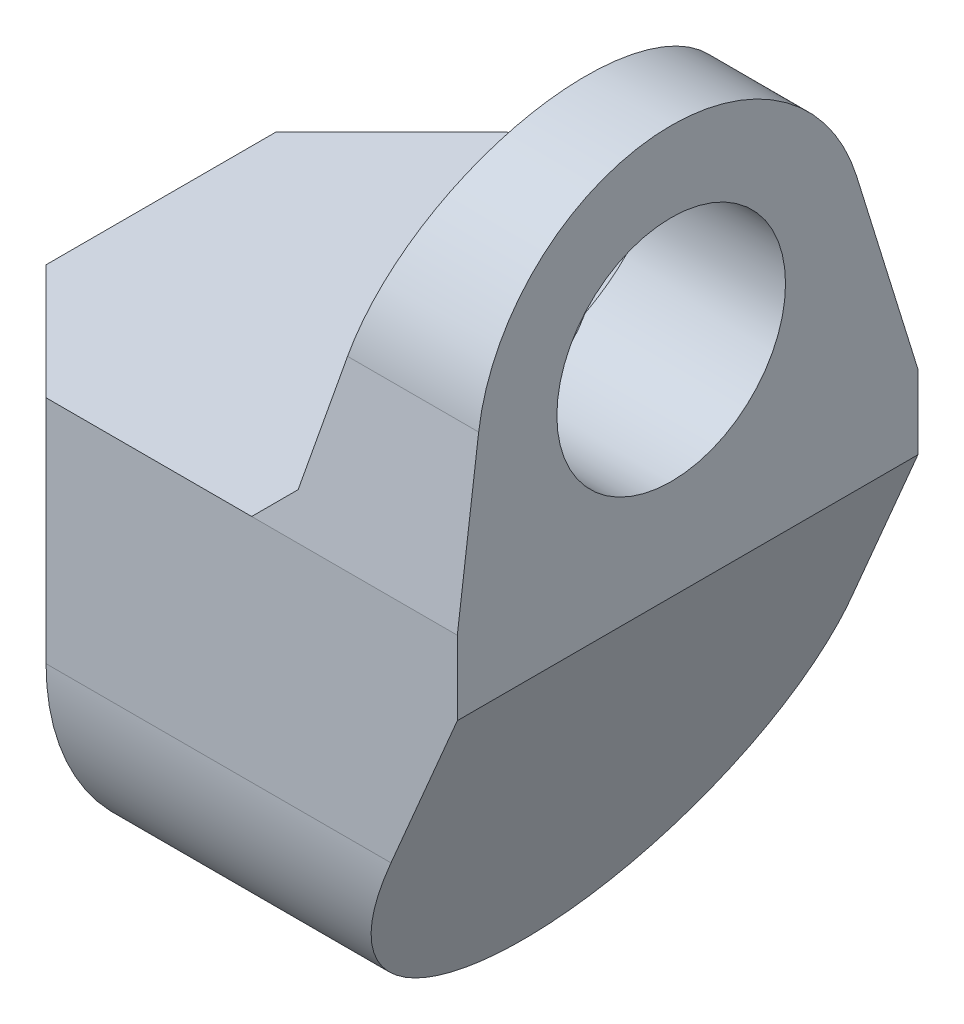
ISO-10303-21;
HEADER;
FILE_DESCRIPTION(('STEP AP214'),'2;1');
FILE_NAME('part.step','',(''),(''),'','','');
FILE_SCHEMA(('AUTOMOTIVE_DESIGN { 1 0 10303 214 1 1 1 1 }'));
ENDSEC;
DATA;
#1=APPLICATION_CONTEXT('core data for automotive mechanical design processes');
#2=APPLICATION_PROTOCOL_DEFINITION('international standard','automotive_design',2000,#1);
#3=PRODUCT_CONTEXT('',#1,'mechanical');
#4=PRODUCT('Part','Part','',(#3));
#5=PRODUCT_RELATED_PRODUCT_CATEGORY('part','',(#4));
#6=PRODUCT_DEFINITION_FORMATION('','',#4);
#7=PRODUCT_DEFINITION_CONTEXT('part definition',#1,'design');
#8=PRODUCT_DEFINITION('design','',#6,#7);
#9=PRODUCT_DEFINITION_SHAPE('','',#8);
#10=(LENGTH_UNIT() NAMED_UNIT(*) SI_UNIT(.MILLI.,.METRE.));
#11=(NAMED_UNIT(*) PLANE_ANGLE_UNIT() SI_UNIT($,.RADIAN.));
#12=(NAMED_UNIT(*) SI_UNIT($,.STERADIAN.) SOLID_ANGLE_UNIT());
#13=UNCERTAINTY_MEASURE_WITH_UNIT(LENGTH_MEASURE(1.E-05),#10,'distance_accuracy_value','');
#14=(GEOMETRIC_REPRESENTATION_CONTEXT(3) GLOBAL_UNCERTAINTY_ASSIGNED_CONTEXT((#13)) GLOBAL_UNIT_ASSIGNED_CONTEXT((#10,
#11,#12)) REPRESENTATION_CONTEXT('',''));
#15=CARTESIAN_POINT('',(0.,0.,0.));
#16=DIRECTION('',(0.,0.,1.));
#17=DIRECTION('',(1.,0.,0.));
#18=AXIS2_PLACEMENT_3D('',#15,#16,#17);
#19=CARTESIAN_POINT('',(319.371159880093,1786.74217662689,-331.667531895439));
#20=DIRECTION('',(-0.965640375771162,0.259882020695022,0.));
#21=DIRECTION('',(-0.259882020695022,-0.965640375771162,0.));
#22=AXIS2_PLACEMENT_3D('',#19,#20,#21);
#23=PLANE('',#22);
#24=DIRECTION('',(0.,0.,1.));
#25=VECTOR('',#24,1.);
#26=CARTESIAN_POINT('',(60.,823.,-331.667531895439));
#27=LINE('',#26,#25);
#28=CARTESIAN_POINT('',(60.0000000000007,823.,-132.249851931471));
#29=VERTEX_POINT('',#28);
#30=CARTESIAN_POINT('',(60.0000000000007,823.,-41.3763217311523));
#31=VERTEX_POINT('',#30);
#32=EDGE_CURVE('E215',#29,#31,#27,.T.);
#33=ORIENTED_EDGE('',*,*,#32,.T.);
#34=CARTESIAN_POINT('',(-43.,440.28418750003,-1.62382802516847E-13));
#35=DIRECTION('',(-0.965640375771162,0.259882020695022,0.));
#36=DIRECTION('',(-0.259882020695022,-0.965640375771162,0.));
#37=AXIS2_PLACEMENT_3D('',#34,#35,#36);
#38=ELLIPSE('',#37,427.116888283168,111.);
#39=CARTESIAN_POINT('',(62.1309255663078,830.917853490161,-35.6158460459868));
#40=VERTEX_POINT('',#39);
#41=EDGE_CURVE('E136',#31,#40,#38,.F.);
#42=ORIENTED_EDGE('',*,*,#41,.T.);
#43=CARTESIAN_POINT('',(76.2427545373522,883.353,10.0000000000007));
#44=DIRECTION('',(-0.965640375771162,0.259882020695022,0.));
#45=DIRECTION('',(-0.259882020695022,-0.965640375771162,0.));
#46=AXIS2_PLACEMENT_3D('',#43,#44,#45);
#47=ELLIPSE('',#46,71.972963997593,69.5);
#48=CARTESIAN_POINT('',(60.0000000000008,823.,44.4639723624544));
#49=VERTEX_POINT('',#48);
#50=EDGE_CURVE('E209',#40,#49,#47,.F.);
#51=ORIENTED_EDGE('',*,*,#50,.T.);
#52=CARTESIAN_POINT('',(60.0000000000009,823.,136.772089545314));
#53=VERTEX_POINT('',#52);
#54=EDGE_CURVE('E214',#49,#53,#27,.T.);
#55=ORIENTED_EDGE('',*,*,#54,.T.);
#56=DIRECTION('',(-0.257885322763063,-0.958221270224104,0.12372209824237));
#57=VECTOR('',#56,1.);
#58=CARTESIAN_POINT('',(77.2960859992147,887.266850546203,128.4741839946));
#59=LINE('',#58,#57);
#60=CARTESIAN_POINT('',(80.3093789853908,898.463305628774,127.028537817942));
#61=VERTEX_POINT('',#60);
#62=EDGE_CURVE('E27',#61,#53,#59,.T.);
#63=ORIENTED_EDGE('',*,*,#62,.F.);
#64=CARTESIAN_POINT('',(76.2427545373526,883.353,10.0000000000009));
#65=DIRECTION('',(-0.965640375771162,0.259882020695022,0.));
#66=DIRECTION('',(0.259882020695022,0.965640375771162,0.));
#67=AXIS2_PLACEMENT_3D('',#64,#65,#66);
#68=ELLIPSE('',#67,122.198701463538,118.);
#69=CARTESIAN_POINT('',(85.6461997966869,918.293264007046,-102.708375691952));
#70=VERTEX_POINT('',#69);
#71=EDGE_CURVE('E219',#70,#61,#68,.F.);
#72=ORIENTED_EDGE('',*,*,#71,.F.);
#73=DIRECTION('',(0.248966036329765,0.925079989114983,0.286780275634968));
#74=VECTOR('',#73,1.);
#75=CARTESIAN_POINT('',(52.1392110414814,793.791764726698,-141.304577859013));
#76=LINE('',#75,#74);
#77=EDGE_CURVE('E222',#29,#70,#76,.T.);
#78=ORIENTED_EDGE('',*,*,#77,.F.);
#79=EDGE_LOOP('',(#33,#42,#51,#55,#63,#72,#78));
#80=FACE_BOUND('',#79,.T.);
#81=ADVANCED_FACE('F17',(#80),#23,.T.);
#82=CARTESIAN_POINT('',(60.,823.,-331.667531895439));
#83=DIRECTION('',(-0.707106781186534,0.707106781186561,0.));
#84=DIRECTION('',(-0.707106781186561,-0.707106781186534,0.));
#85=AXIS2_PLACEMENT_3D('',#82,#83,#84);
#86=PLANE('',#85);
#87=DIRECTION('',(0.,0.,-1.));
#88=VECTOR('',#87,1.);
#89=CARTESIAN_POINT('',(35.,798.,140.));
#90=LINE('',#89,#88);
#91=CARTESIAN_POINT('',(35.,798.,-78.9746794865287));
#92=VERTEX_POINT('',#91);
#93=CARTESIAN_POINT('',(35.000000000002,798.,-140.));
#94=VERTEX_POINT('',#93);
#95=EDGE_CURVE('E21',#92,#94,#90,.T.);
#96=ORIENTED_EDGE('',*,*,#95,.F.);
#97=CARTESIAN_POINT('',(-43.,720.,-1.62382802516847E-13));
#98=DIRECTION('',(-0.707106781186534,0.707106781186561,0.));
#99=DIRECTION('',(-0.707106781186561,-0.707106781186534,0.));
#100=AXIS2_PLACEMENT_3D('',#97,#98,#99);
#101=ELLIPSE('',#100,156.97770542341,111.);
#102=EDGE_CURVE('E126',#92,#31,#101,.F.);
#103=ORIENTED_EDGE('',*,*,#102,.T.);
#104=ORIENTED_EDGE('',*,*,#32,.F.);
#105=DIRECTION('',(0.690706623375974,0.690706623375947,0.214123144123091));
#106=VECTOR('',#105,1.);
#107=CARTESIAN_POINT('',(34.9999999999993,798.,-140.));
#108=LINE('',#107,#106);
#109=EDGE_CURVE('E223',#94,#29,#108,.T.);
#110=ORIENTED_EDGE('',*,*,#109,.F.);
#111=EDGE_LOOP('',(#96,#103,#104,#110));
#112=FACE_BOUND('',#111,.T.);
#113=ADVANCED_FACE('F281',(#112),#86,.T.);
#114=CARTESIAN_POINT('',(120.353000000003,883.353,10.0000000000007));
#115=DIRECTION('',(-0.707106781186534,0.707106781186561,0.));
#116=DIRECTION('',(-0.707106781186561,-0.707106781186534,0.));
#117=AXIS2_PLACEMENT_3D('',#114,#115,#116);
#118=ELLIPSE('',#117,98.287842584932,69.5);
#119=CARTESIAN_POINT('',(59.2690958361265,822.26909583613,43.1512692381247));
#120=VERTEX_POINT('',#119);
#121=EDGE_CURVE('E11',#49,#120,#118,.F.);
#122=ORIENTED_EDGE('',*,*,#121,.T.);
#123=CARTESIAN_POINT('',(35.,798.,78.9746794865285));
#124=VERTEX_POINT('',#123);
#125=EDGE_CURVE('E123',#120,#124,#101,.F.);
#126=ORIENTED_EDGE('',*,*,#125,.T.);
#127=CARTESIAN_POINT('',(35.0000000000036,798.,140.));
#128=VERTEX_POINT('',#127);
#129=EDGE_CURVE('E133',#128,#124,#90,.T.);
#130=ORIENTED_EDGE('',*,*,#129,.F.);
#131=DIRECTION('',(-0.704178025032377,-0.70417802503235,0.0909209443584944));
#132=VECTOR('',#131,1.);
#133=CARTESIAN_POINT('',(85.6468987058924,848.646898705895,133.460653846792));
#134=LINE('',#133,#132);
#135=EDGE_CURVE('E218',#53,#128,#134,.T.);
#136=ORIENTED_EDGE('',*,*,#135,.F.);
#137=ORIENTED_EDGE('',*,*,#54,.F.);
#138=EDGE_LOOP('',(#122,#126,#130,#136,#137));
#139=FACE_BOUND('',#138,.T.);
#140=ADVANCED_FACE('F131',(#139),#86,.T.);
#141=CARTESIAN_POINT('',(407.98183232407,883.353,10.0000000000009));
#142=DIRECTION('',(-1.,0.,0.));
#143=DIRECTION('',(0.,0.,-1.));
#144=AXIS2_PLACEMENT_3D('',#141,#142,#143);
#145=CYLINDRICAL_SURFACE('',#144,69.5);
#146=CARTESIAN_POINT('',(160.000000000003,883.353,10.0000000000007));
#147=DIRECTION('',(1.,0.,0.));
#148=DIRECTION('',(0.,0.,-1.));
#149=AXIS2_PLACEMENT_3D('',#146,#147,#148);
#150=CIRCLE('',#149,69.5);
#151=CARTESIAN_POINT('',(160.000000000004,883.353,-59.4999999999993));
#152=VERTEX_POINT('',#151);
#153=EDGE_CURVE('E211',#152,#152,#150,.F.);
#154=ORIENTED_EDGE('',*,*,#153,.F.);
#155=EDGE_LOOP('',(#154));
#156=FACE_BOUND('',#155,.T.);
#157=ORIENTED_EDGE('',*,*,#50,.F.);
#158=CARTESIAN_POINT('',(65.9736376474425,945.5,-21.1127046558196));
#159=CARTESIAN_POINT('',(65.8006410151382,945.052943275867,-22.0057150498637));
#160=CARTESIAN_POINT('',(65.6183792952828,944.58736345789,-22.8875955845663));
#161=CARTESIAN_POINT('',(65.237097127852,943.620431751345,-24.6276898034623));
#162=CARTESIAN_POINT('',(65.0380784577303,943.119083657672,-25.4859059850082));
#163=CARTESIAN_POINT('',(64.625155384937,942.082143196159,-27.1768851356325));
#164=CARTESIAN_POINT('',(64.4112610867585,941.546574093157,-28.0096648400049));
#165=CARTESIAN_POINT('',(63.9703068368445,940.442132951406,-29.6491882064526));
#166=CARTESIAN_POINT('',(63.7432465332711,939.873260022667,-30.455931171845));
#167=CARTESIAN_POINT('',(63.0458105470094,938.120253409246,-32.833041335095));
#168=CARTESIAN_POINT('',(62.5584331639003,936.887881449309,-34.3633011931569));
#169=CARTESIAN_POINT('',(61.5537214462687,934.303694536806,-37.3087469547833));
#170=CARTESIAN_POINT('',(61.0363816923088,932.951857952702,-38.7239119285924));
#171=CARTESIAN_POINT('',(59.9886662929027,930.139924376088,-41.429874750167));
#172=CARTESIAN_POINT('',(59.4583228051839,928.680079360265,-42.7209468557326));
#173=CARTESIAN_POINT('',(58.3996418415073,925.656845031051,-45.1763241492804));
#174=CARTESIAN_POINT('',(57.8713042724953,924.093460584463,-46.3406352887876));
#175=CARTESIAN_POINT('',(56.8328008101944,920.868606532021,-48.5375086898656));
#176=CARTESIAN_POINT('',(56.3226532208256,919.207042362254,-49.5699408012391));
#177=CARTESIAN_POINT('',(55.3382740192143,915.794180629648,-51.4951760424935));
#178=CARTESIAN_POINT('',(54.8640434567459,914.042880446534,-52.3879750920252));
#179=CARTESIAN_POINT('',(54.1866659897433,911.330327262562,-53.6281852875815));
#180=CARTESIAN_POINT('',(53.9637208159321,910.398458817249,-54.0298863150441));
#181=CARTESIAN_POINT('',(53.5343950686727,908.514768990434,-54.793269075291));
#182=CARTESIAN_POINT('',(53.3280125358563,907.562949985943,-55.1549555437382));
#183=CARTESIAN_POINT('',(52.9341016175231,905.640690347141,-55.8372940113944));
#184=CARTESIAN_POINT('',(52.7465764605586,904.670246557853,-56.1579389864861));
#185=CARTESIAN_POINT('',(52.3926788914098,902.712738220274,-56.7570071610336));
#186=CARTESIAN_POINT('',(52.2263035893257,901.725675963634,-57.0354361298564));
#187=CARTESIAN_POINT('',(51.9170357818495,899.738437717045,-57.5486399579915));
#188=CARTESIAN_POINT('',(51.7741040893184,898.738286691514,-57.7834877535433));
#189=CARTESIAN_POINT('',(51.5132881650056,896.72554506547,-58.2091117240324));
#190=CARTESIAN_POINT('',(51.3954005168281,895.712956181635,-58.399893910512));
#191=CARTESIAN_POINT('',(51.1862840631226,893.677701717087,-58.736557465581));
#192=CARTESIAN_POINT('',(51.095052696653,892.655037114141,-58.8824431475716));
#193=CARTESIAN_POINT('',(50.9405425656523,890.602153194384,-59.1286364778693));
#194=CARTESIAN_POINT('',(50.8772626515898,889.571934190027,-59.228946000546));
#195=CARTESIAN_POINT('',(50.7862099977124,887.646950100262,-59.3729984302778));
#196=CARTESIAN_POINT('',(50.7547825236857,886.752788082166,-59.4225729640935));
#197=CARTESIAN_POINT('',(50.7138366967467,884.96272121537,-59.4871272609092));
#198=CARTESIAN_POINT('',(50.704317877017,884.066816404212,-59.5021077610196));
#199=CARTESIAN_POINT('',(50.7072970566977,882.275216279746,-59.4974157194432));
#200=CARTESIAN_POINT('',(50.7197931120979,881.379520954924,-59.4777462375023));
#201=CARTESIAN_POINT('',(50.7666572979133,879.590126157773,-59.4038373348058));
#202=CARTESIAN_POINT('',(50.8010255974316,878.696426700927,-59.3495976467738));
#203=CARTESIAN_POINT('',(50.8912591814466,876.912723092055,-59.2067443787885));
#204=CARTESIAN_POINT('',(50.9471280309539,876.022719577604,-59.1181250983282));
#205=CARTESIAN_POINT('',(51.0797552778546,874.248243096868,-58.9068347753321));
#206=CARTESIAN_POINT('',(51.1565158878126,873.363770726519,-58.7841601260978));
#207=CARTESIAN_POINT('',(51.3300969712677,871.602212046367,-58.5052118259547));
#208=CARTESIAN_POINT('',(51.4269153796395,870.725124985849,-58.3489416339377));
#209=CARTESIAN_POINT('',(51.6396049671989,868.979795583799,-58.0033290096283));
#210=CARTESIAN_POINT('',(51.7554779646052,868.11155409473,-57.8139834211223));
#211=CARTESIAN_POINT('',(52.1132329789151,865.638092809486,-57.2247794475001));
#212=CARTESIAN_POINT('',(52.3773702093094,864.045473825537,-56.7845690144608));
#213=CARTESIAN_POINT('',(52.9593364003916,860.904881995739,-55.795467865366));
#214=CARTESIAN_POINT('',(53.2771619018856,859.356906280994,-55.2465841508569));
#215=CARTESIAN_POINT('',(53.9570468037398,856.311694317685,-54.0444977626692));
#216=CARTESIAN_POINT('',(54.3191152674487,854.814468545966,-53.3912737060042));
#217=CARTESIAN_POINT('',(55.0775017552687,851.876646407052,-51.9850142151998));
#218=CARTESIAN_POINT('',(55.4738226249766,850.436054759358,-51.2319704855339));
#219=CARTESIAN_POINT('',(56.3435311182686,847.433985152709,-49.5266915979745));
#220=CARTESIAN_POINT('',(56.8202596083883,845.880941081653,-48.5612911019348));
#221=CARTESIAN_POINT('',(57.7905325151657,842.859178812943,-46.5139952955085));
#222=CARTESIAN_POINT('',(58.2840780082487,841.390466029396,-45.4320925184151));
#223=CARTESIAN_POINT('',(59.274642318482,838.542095963007,-43.1559844420445));
#224=CARTESIAN_POINT('',(59.771663460156,837.162506202796,-41.9616956398438));
#225=CARTESIAN_POINT('',(60.7555235783992,834.499511680632,-39.4663155968243));
#226=CARTESIAN_POINT('',(61.2423620705096,833.216111487609,-38.1652192888743));
#227=CARTESIAN_POINT('',(62.2432632125077,830.621479249381,-35.3180834109589));
#228=CARTESIAN_POINT('',(62.7547538313844,829.321677685564,-33.7606939919189));
#229=CARTESIAN_POINT('',(63.732623546923,826.856889370891,-30.5286088085379));
#230=CARTESIAN_POINT('',(64.1989988105453,825.691914073342,-28.8539030977077));
#231=CARTESIAN_POINT('',(64.8522031641003,824.054128742296,-26.2620855146069));
#232=CARTESIAN_POINT('',(65.0621926981134,823.526527546304,-25.3849455623376));
#233=CARTESIAN_POINT('',(65.4648562963991,822.509028579007,-23.6052274711292));
#234=CARTESIAN_POINT('',(65.6575323638023,822.019126446947,-22.7026522909047));
#235=CARTESIAN_POINT('',(66.0236767692049,821.078386534048,-20.8736163702351));
#236=CARTESIAN_POINT('',(66.1971458238485,820.627547295846,-19.9471565225563));
#237=CARTESIAN_POINT('',(66.5230891543865,819.766245901119,-18.0720335144621));
#238=CARTESIAN_POINT('',(66.6755638704275,819.355782898156,-17.1233708200179));
#239=CARTESIAN_POINT('',(66.9476452150412,818.604646305519,-15.2749456286948));
#240=CARTESIAN_POINT('',(67.0688294012886,818.26107426999,-14.3765921560585));
#241=CARTESIAN_POINT('',(67.2904173386957,817.610798541724,-12.5641275112243));
#242=CARTESIAN_POINT('',(67.3908216690177,817.304093821545,-11.6500167789716));
#243=CARTESIAN_POINT('',(67.5697160534962,816.728457870728,-9.80786683969222));
#244=CARTESIAN_POINT('',(67.6482063668243,816.459526193376,-8.87982779752886));
#245=CARTESIAN_POINT('',(67.78227191055,815.960241142449,-7.01178287771039));
#246=CARTESIAN_POINT('',(67.8378471103478,815.729887820391,-6.07177698407701));
#247=CARTESIAN_POINT('',(67.9251968294785,815.308605416156,-4.18260466745811));
#248=CARTESIAN_POINT('',(67.9569890010147,815.11764717062,-3.23344556922033));
#249=CARTESIAN_POINT('',(67.996154684331,814.775483853178,-1.327476288485));
#250=CARTESIAN_POINT('',(68.0035280411537,814.624279033545,-0.37066605747337));
#251=CARTESIAN_POINT('',(67.9933488840233,814.362021723011,1.54822093732195));
#252=CARTESIAN_POINT('',(67.9757986499214,814.250965560732,2.51029721138283));
#253=CARTESIAN_POINT('',(67.9154558848492,814.06920192676,4.43744781778397));
#254=CARTESIAN_POINT('',(67.8726641157207,813.998493237424,5.40252205876492));
#255=CARTESIAN_POINT('',(67.7684868670149,813.90361612388,7.21548405606073));
#256=CARTESIAN_POINT('',(67.7100074332142,813.874821509024,8.06330154448791));
#257=CARTESIAN_POINT('',(67.5735295399192,813.848255207362,9.75792918344013));
#258=CARTESIAN_POINT('',(67.4955294370606,813.850486133331,10.6047392431203));
#259=CARTESIAN_POINT('',(67.3201794201096,813.885774754575,12.2955385265854));
#260=CARTESIAN_POINT('',(67.2228332735057,813.91882645237,13.1395282671163));
#261=CARTESIAN_POINT('',(67.0090315666341,814.015448497997,14.8234062900644));
#262=CARTESIAN_POINT('',(66.8925741550674,814.079021803592,15.6632941670114));
#263=CARTESIAN_POINT('',(66.6409645332065,814.236263198989,17.337090546224));
#264=CARTESIAN_POINT('',(66.505819932369,814.329919059552,18.1710013377205));
#265=CARTESIAN_POINT('',(66.2172622723176,814.546842555121,19.8318052819242));
#266=CARTESIAN_POINT('',(66.0638474672046,814.670113021243,20.6586977558603));
#267=CARTESIAN_POINT('',(65.5770000954945,815.083529270383,23.1267062150006));
#268=CARTESIAN_POINT('',(65.2169055952345,815.417316949005,24.7555437392515));
#269=CARTESIAN_POINT('',(64.4314924694944,816.195485766137,27.9679653599367));
#270=CARTESIAN_POINT('',(64.0062521615352,816.639734504,29.5516011208587));
#271=CARTESIAN_POINT('',(63.0963618668168,817.633236276611,32.6679769417079));
#272=CARTESIAN_POINT('',(62.6117118746372,818.182489320941,34.2007169969913));
#273=CARTESIAN_POINT('',(61.5890816661364,819.380797581371,37.2109515269898));
#274=CARTESIAN_POINT('',(61.0510257635024,820.029995176527,38.6883633895165));
#275=CARTESIAN_POINT('',(59.9294114040026,821.421631850755,41.5805510790241));
#276=CARTESIAN_POINT('',(59.345852397235,822.164072056724,42.9953261487199));
#277=CARTESIAN_POINT('',(58.0921736685789,823.799925054497,45.8696518201811));
#278=CARTESIAN_POINT('',(57.4188678995302,824.70068197836,47.323626874829));
#279=CARTESIAN_POINT('',(56.037415342755,826.598337909347,50.1504264688077));
#280=CARTESIAN_POINT('',(55.3292627561398,827.59525294491,51.5232374173004));
#281=CARTESIAN_POINT('',(54.2500622903609,829.156222962812,53.5162942521797));
#282=CARTESIAN_POINT('',(53.8882171134795,829.686389685431,54.1684208418531));
#283=CARTESIAN_POINT('',(53.1596396225916,830.768627012565,55.4514907144319));
#284=CARTESIAN_POINT('',(52.7929072694249,831.320697792665,56.0824338274543));
#285=CARTESIAN_POINT('',(52.0560299418089,832.44592723703,57.3225182965891));
#286=CARTESIAN_POINT('',(51.685886603598,833.019076148379,57.9316694847789));
#287=CARTESIAN_POINT('',(50.9433567274659,834.186243185277,59.1281808497347));
#288=CARTESIAN_POINT('',(50.5709702592938,834.780260664674,59.7155417000382));
#289=CARTESIAN_POINT('',(50.1981180000008,835.384502004373,60.2918800607336));
#290=B_SPLINE_CURVE_WITH_KNOTS('',3,(#158,#159,#160,#161,#162,#163,#164,#165,#166,#167,#168,
#169,#170,#171,#172,#173,#174,#175,#176,#177,#178,#179,#180,#181,#182,#183,#184,#185,#186,#187,
#188,#189,#190,#191,#192,#193,#194,#195,#196,#197,#198,#199,#200,#201,#202,#203,#204,#205,#206,
#207,#208,#209,#210,#211,#212,#213,#214,#215,#216,#217,#218,#219,#220,#221,#222,#223,#224,#225,
#226,#227,#228,#229,#230,#231,#232,#233,#234,#235,#236,#237,#238,#239,#240,#241,#242,#243,#244,
#245,#246,#247,#248,#249,#250,#251,#252,#253,#254,#255,#256,#257,#258,#259,#260,#261,#262,#263,
#264,#265,#266,#267,#268,#269,#270,#271,#272,#273,#274,#275,#276,#277,#278,#279,#280,#281,#282,
#283,#284,#285,#286,#287,#288,#289),.UNSPECIFIED.,.F.,.F.,(4,2,2,2,2,2,2,2,2,2,2,2,2,2,2,2,2,2,
2,2,2,2,2,2,2,2,2,2,2,2,2,2,2,2,2,2,2,2,2,2,2,2,2,2,2,2,2,2,2,2,2,2,2,2,2,2,2,2,2,2,2,2,2,2,2,
4),(0.,3.04025190717846,6.08018173215912,9.11806643589625,12.1560323591125,18.2211630474795,
24.2873942120526,30.3398942920588,36.3921100798718,42.4502533405798,48.5085735989414,
51.6245612352881,54.7401797038094,57.8563306892707,60.972055427536,64.0825177994604,
67.1925555832457,70.3022944789133,73.4119054715707,76.0992575413722,78.786552350047,
81.4736098706672,84.1606881662822,86.8482121990084,89.5360209677354,92.223553140518,
94.9113419108005,99.9256374858017,104.939610107411,109.954611588874,114.97003010426,
120.633542869841,126.297418829906,131.965536791672,137.633923814241,143.902239439252,
150.171087158893,153.30487946269,156.438308725424,159.5716210355,162.704867645606,
165.612093476036,168.519238267298,171.426348675038,174.333462964787,177.238417393878,
180.143390257246,183.048097409333,185.952716895818,188.502902739182,191.053303344395,
193.603207765183,196.153359339978,198.702475529908,201.251835508926,206.349369150062,
211.440822001677,216.532275317839,221.631050107696,226.729886525424,232.239510145662,
237.750053748334,240.494717487287,243.239403232073,245.982834597736,248.726181093405),.UNSPECIFIED.);
#291=EDGE_CURVE('E128',#40,#120,#290,.T.);
#292=ORIENTED_EDGE('',*,*,#291,.T.);
#293=ORIENTED_EDGE('',*,*,#121,.F.);
#294=EDGE_LOOP('',(#157,#292,#293));
#295=FACE_BOUND('',#294,.T.);
#296=ADVANCED_FACE('F296',(#156,#295),#145,.F.);
#297=CARTESIAN_POINT('',(160.000000000003,883.353,10.0000000000008));
#298=DIRECTION('',(1.,0.,0.));
#299=DIRECTION('',(0.,0.955155726202987,0.296103932263055));
#300=AXIS2_PLACEMENT_3D('',#297,#298,#299);
#301=PLANE('',#300);
#302=DIRECTION('',(0.,-0.991767269643567,0.128053437531928));
#303=VECTOR('',#302,1.);
#304=CARTESIAN_POINT('',(160.000000000003,898.463305628772,127.028537817942));
#305=LINE('',#304,#303);
#306=CARTESIAN_POINT('',(160.000000000003,898.463305628772,127.028537817942));
#307=VERTEX_POINT('',#306);
#308=CARTESIAN_POINT('',(160.,798.,140.));
#309=VERTEX_POINT('',#308);
#310=EDGE_CURVE('E145',#307,#309,#305,.T.);
#311=ORIENTED_EDGE('',*,*,#310,.T.);
#312=DIRECTION('',(0.,-1.,0.));
#313=VECTOR('',#312,1.);
#314=CARTESIAN_POINT('',(160.,798.,140.));
#315=LINE('',#314,#313);
#316=CARTESIAN_POINT('',(160.,753.,140.));
#317=VERTEX_POINT('',#316);
#318=EDGE_CURVE('E182',#309,#317,#315,.T.);
#319=ORIENTED_EDGE('',*,*,#318,.T.);
#320=DIRECTION('',(0.,0.,-1.));
#321=VECTOR('',#320,1.);
#322=CARTESIAN_POINT('',(160.,753.,-1.50763240275803E-13));
#323=LINE('',#322,#321);
#324=CARTESIAN_POINT('',(160.,753.,-140.));
#325=VERTEX_POINT('',#324);
#326=EDGE_CURVE('E181',#317,#325,#323,.T.);
#327=ORIENTED_EDGE('',*,*,#326,.T.);
#328=DIRECTION('',(0.,1.,0.));
#329=VECTOR('',#328,1.);
#330=CARTESIAN_POINT('',(160.,658.,-140.));
#331=LINE('',#330,#329);
#332=CARTESIAN_POINT('',(160.,798.,-140.));
#333=VERTEX_POINT('',#332);
#334=EDGE_CURVE('E167',#325,#333,#331,.T.);
#335=ORIENTED_EDGE('',*,*,#334,.T.);
#336=DIRECTION('',(0.,0.955155726202987,0.296103932263055));
#337=VECTOR('',#336,1.);
#338=CARTESIAN_POINT('',(160.,798.,-140.));
#339=LINE('',#338,#337);
#340=CARTESIAN_POINT('',(160.000000000003,918.293264007044,-102.708375691952));
#341=VERTEX_POINT('',#340);
#342=EDGE_CURVE('E179',#333,#341,#339,.T.);
#343=ORIENTED_EDGE('',*,*,#342,.T.);
#344=CARTESIAN_POINT('',(160.000000000003,883.353,10.0000000000008));
#345=DIRECTION('',(1.,0.,0.));
#346=DIRECTION('',(0.,0.,1.));
#347=AXIS2_PLACEMENT_3D('',#344,#345,#346);
#348=CIRCLE('',#347,118.);
#349=EDGE_CURVE('E226',#341,#307,#348,.T.);
#350=ORIENTED_EDGE('',*,*,#349,.T.);
#351=EDGE_LOOP('',(#311,#319,#327,#335,#343,#350));
#352=FACE_BOUND('',#351,.T.);
#353=ORIENTED_EDGE('',*,*,#153,.T.);
#354=EDGE_LOOP('',(#353));
#355=FACE_BOUND('',#354,.T.);
#356=ADVANCED_FACE('F176',(#352,#355),#301,.T.);
#357=CARTESIAN_POINT('',(35.,798.,-140.));
#358=DIRECTION('',(0.,0.296103932263055,-0.955155726202987));
#359=DIRECTION('',(0.,-0.955155726202987,-0.296103932263055));
#360=AXIS2_PLACEMENT_3D('',#357,#358,#359);
#361=PLANE('',#360);
#362=ORIENTED_EDGE('',*,*,#109,.T.);
#363=ORIENTED_EDGE('',*,*,#77,.T.);
#364=DIRECTION('',(1.,0.,0.));
#365=VECTOR('',#364,1.);
#366=CARTESIAN_POINT('',(35.0000000000037,918.293264007047,-102.708375691952));
#367=LINE('',#366,#365);
#368=EDGE_CURVE('E156',#70,#341,#367,.T.);
#369=ORIENTED_EDGE('',*,*,#368,.T.);
#370=ORIENTED_EDGE('',*,*,#342,.F.);
#371=DIRECTION('',(1.,0.,0.));
#372=VECTOR('',#371,1.);
#373=CARTESIAN_POINT('',(35.,798.,-140.));
#374=LINE('',#373,#372);
#375=EDGE_CURVE('E148',#94,#333,#374,.T.);
#376=ORIENTED_EDGE('',*,*,#375,.F.);
#377=EDGE_LOOP('',(#362,#363,#369,#370,#376));
#378=FACE_BOUND('',#377,.T.);
#379=ADVANCED_FACE('F19',(#378),#361,.T.);
#380=CARTESIAN_POINT('',(35.0000000000037,883.353,10.0000000000009));
#381=DIRECTION('',(1.,0.,0.));
#382=DIRECTION('',(0.,0.296103932263055,-0.955155726202987));
#383=AXIS2_PLACEMENT_3D('',#380,#381,#382);
#384=CYLINDRICAL_SURFACE('',#383,118.);
#385=ORIENTED_EDGE('',*,*,#368,.F.);
#386=ORIENTED_EDGE('',*,*,#71,.T.);
#387=DIRECTION('',(1.,0.,0.));
#388=VECTOR('',#387,1.);
#389=CARTESIAN_POINT('',(35.0000000000036,898.463305628774,127.028537817942));
#390=LINE('',#389,#388);
#391=EDGE_CURVE('E143',#61,#307,#390,.T.);
#392=ORIENTED_EDGE('',*,*,#391,.T.);
#393=ORIENTED_EDGE('',*,*,#349,.F.);
#394=EDGE_LOOP('',(#385,#386,#392,#393));
#395=FACE_BOUND('',#394,.T.);
#396=ADVANCED_FACE('F330',(#395),#384,.T.);
#397=CARTESIAN_POINT('',(35.0000000000036,898.463305628774,127.028537817942));
#398=DIRECTION('',(0.,0.128053437531928,0.991767269643567));
#399=DIRECTION('',(0.,0.991767269643567,-0.128053437531928));
#400=AXIS2_PLACEMENT_3D('',#397,#398,#399);
#401=PLANE('',#400);
#402=ORIENTED_EDGE('',*,*,#391,.F.);
#403=ORIENTED_EDGE('',*,*,#62,.T.);
#404=ORIENTED_EDGE('',*,*,#135,.T.);
#405=DIRECTION('',(1.,0.,0.));
#406=VECTOR('',#405,1.);
#407=CARTESIAN_POINT('',(35.,798.,140.));
#408=LINE('',#407,#406);
#409=EDGE_CURVE('E43',#128,#309,#408,.T.);
#410=ORIENTED_EDGE('',*,*,#409,.T.);
#411=ORIENTED_EDGE('',*,*,#310,.F.);
#412=EDGE_LOOP('',(#402,#403,#404,#410,#411));
#413=FACE_BOUND('',#412,.T.);
#414=ADVANCED_FACE('F291',(#413),#401,.T.);
#415=CARTESIAN_POINT('',(-160.,658.,-140.));
#416=DIRECTION('',(0.,0.,-1.));
#417=DIRECTION('',(0.,-1.,0.));
#418=AXIS2_PLACEMENT_3D('',#415,#416,#417);
#419=PLANE('',#418);
#420=ORIENTED_EDGE('',*,*,#334,.F.);
#421=DIRECTION('',(-0.390731128489273,-0.92050485345244,0.));
#422=VECTOR('',#421,1.);
#423=CARTESIAN_POINT('',(76.9766987573541,557.409359349015,-140.));
#424=LINE('',#423,#422);
#425=CARTESIAN_POINT('',(119.674892460088,658.,-140.));
#426=VERTEX_POINT('',#425);
#427=EDGE_CURVE('E237',#325,#426,#424,.T.);
#428=ORIENTED_EDGE('',*,*,#427,.T.);
#429=DIRECTION('',(1.,0.,0.));
#430=VECTOR('',#429,1.);
#431=CARTESIAN_POINT('',(-160.,658.,-140.));
#432=LINE('',#431,#430);
#433=CARTESIAN_POINT('',(-90.,658.,-140.));
#434=VERTEX_POINT('',#433);
#435=EDGE_CURVE('E193',#434,#426,#432,.T.);
#436=ORIENTED_EDGE('',*,*,#435,.F.);
#437=DIRECTION('',(0.,1.,0.));
#438=VECTOR('',#437,1.);
#439=CARTESIAN_POINT('',(-90.,798.,-140.));
#440=LINE('',#439,#438);
#441=CARTESIAN_POINT('',(-90.,798.,-140.));
#442=VERTEX_POINT('',#441);
#443=EDGE_CURVE('E259',#434,#442,#440,.T.);
#444=ORIENTED_EDGE('',*,*,#443,.T.);
#445=DIRECTION('',(1.,0.,0.));
#446=VECTOR('',#445,1.);
#447=CARTESIAN_POINT('',(-160.,798.,-140.));
#448=LINE('',#447,#446);
#449=EDGE_CURVE('E169',#442,#94,#448,.T.);
#450=ORIENTED_EDGE('',*,*,#449,.T.);
#451=ORIENTED_EDGE('',*,*,#375,.T.);
#452=EDGE_LOOP('',(#420,#428,#436,#444,#450,#451));
#453=FACE_BOUND('',#452,.T.);
#454=ADVANCED_FACE('F165',(#453),#419,.T.);
#455=CARTESIAN_POINT('',(-160.,798.,140.));
#456=DIRECTION('',(0.,0.,1.));
#457=DIRECTION('',(0.,1.,0.));
#458=AXIS2_PLACEMENT_3D('',#455,#456,#457);
#459=PLANE('',#458);
#460=DIRECTION('',(1.,0.,0.));
#461=VECTOR('',#460,1.);
#462=CARTESIAN_POINT('',(-160.,658.,140.));
#463=LINE('',#462,#461);
#464=CARTESIAN_POINT('',(-90.,658.,140.));
#465=VERTEX_POINT('',#464);
#466=CARTESIAN_POINT('',(119.674892460088,658.,140.));
#467=VERTEX_POINT('',#466);
#468=EDGE_CURVE('E196',#465,#467,#463,.T.);
#469=ORIENTED_EDGE('',*,*,#468,.T.);
#470=DIRECTION('',(0.390731128489273,0.92050485345244,0.));
#471=VECTOR('',#470,1.);
#472=CARTESIAN_POINT('',(127.330484781059,676.035445281144,140.));
#473=LINE('',#472,#471);
#474=EDGE_CURVE('E232',#467,#317,#473,.T.);
#475=ORIENTED_EDGE('',*,*,#474,.T.);
#476=ORIENTED_EDGE('',*,*,#318,.F.);
#477=ORIENTED_EDGE('',*,*,#409,.F.);
#478=DIRECTION('',(1.,0.,0.));
#479=VECTOR('',#478,1.);
#480=CARTESIAN_POINT('',(-160.,798.,140.));
#481=LINE('',#480,#479);
#482=CARTESIAN_POINT('',(-90.,798.,140.));
#483=VERTEX_POINT('',#482);
#484=EDGE_CURVE('E141',#483,#128,#481,.T.);
#485=ORIENTED_EDGE('',*,*,#484,.F.);
#486=DIRECTION('',(0.,-1.,0.));
#487=VECTOR('',#486,1.);
#488=CARTESIAN_POINT('',(-90.,658.,140.));
#489=LINE('',#488,#487);
#490=EDGE_CURVE('E208',#483,#465,#489,.T.);
#491=ORIENTED_EDGE('',*,*,#490,.T.);
#492=EDGE_LOOP('',(#469,#475,#476,#477,#485,#491));
#493=FACE_BOUND('',#492,.T.);
#494=ADVANCED_FACE('F231',(#493),#459,.T.);
#495=CARTESIAN_POINT('',(-160.,658.,-2.4980018054066E-13));
#496=DIRECTION('',(1.,0.,0.));
#497=DIRECTION('',(0.,1.,0.));
#498=AXIS2_PLACEMENT_3D('',#495,#496,#497);
#499=CYLINDRICAL_SURFACE('',#498,140.);
#500=ORIENTED_EDGE('',*,*,#435,.T.);
#501=CARTESIAN_POINT('',(119.674892460088,658.,-1.57100280154248E-13));
#502=DIRECTION('',(0.92050485345244,-0.390731128489273,0.));
#503=DIRECTION('',(0.390731128489273,0.92050485345244,0.));
#504=AXIS2_PLACEMENT_3D('',#501,#502,#503);
#505=ELLIPSE('',#504,152.090452836741,140.);
#506=EDGE_CURVE('E239',#426,#467,#505,.F.);
#507=ORIENTED_EDGE('',*,*,#506,.T.);
#508=ORIENTED_EDGE('',*,*,#468,.F.);
#509=CARTESIAN_POINT('',(-90.,658.,-2.26598265738905E-13));
#510=DIRECTION('',(1.,0.,0.));
#511=DIRECTION('',(0.,0.,-1.));
#512=AXIS2_PLACEMENT_3D('',#509,#510,#511);
#513=CIRCLE('',#512,140.);
#514=EDGE_CURVE('E254',#465,#434,#513,.T.);
#515=ORIENTED_EDGE('',*,*,#514,.T.);
#516=EDGE_LOOP('',(#500,#507,#508,#515));
#517=FACE_BOUND('',#516,.T.);
#518=ADVANCED_FACE('F263',(#517),#499,.T.);
#519=CARTESIAN_POINT('',(-160.,798.,-140.));
#520=DIRECTION('',(0.,1.,0.));
#521=DIRECTION('',(0.,0.,-1.));
#522=AXIS2_PLACEMENT_3D('',#519,#520,#521);
#523=PLANE('',#522);
#524=ORIENTED_EDGE('',*,*,#129,.T.);
#525=CARTESIAN_POINT('',(-43.,798.,-1.62382802516847E-13));
#526=DIRECTION('',(0.,1.,0.));
#527=DIRECTION('',(-1.,0.,0.));
#528=AXIS2_PLACEMENT_3D('',#525,#526,#527);
#529=CIRCLE('',#528,111.);
#530=EDGE_CURVE('E35',#124,#92,#529,.T.);
#531=ORIENTED_EDGE('',*,*,#530,.T.);
#532=ORIENTED_EDGE('',*,*,#95,.T.);
#533=ORIENTED_EDGE('',*,*,#449,.F.);
#534=DIRECTION('',(-0.707106781186548,0.,0.707106781186547));
#535=VECTOR('',#534,1.);
#536=CARTESIAN_POINT('',(-125.,798.,-105.));
#537=LINE('',#536,#535);
#538=CARTESIAN_POINT('',(-160.,798.,-70.0000000000008));
#539=VERTEX_POINT('',#538);
#540=EDGE_CURVE('E270',#442,#539,#537,.T.);
#541=ORIENTED_EDGE('',*,*,#540,.T.);
#542=DIRECTION('',(0.,0.,1.));
#543=VECTOR('',#542,1.);
#544=CARTESIAN_POINT('',(-160.,798.,-140.));
#545=LINE('',#544,#543);
#546=CARTESIAN_POINT('',(-160.,798.,70.));
#547=VERTEX_POINT('',#546);
#548=EDGE_CURVE('E185',#539,#547,#545,.T.);
#549=ORIENTED_EDGE('',*,*,#548,.T.);
#550=DIRECTION('',(0.707106781186547,0.,0.707106781186548));
#551=VECTOR('',#550,1.);
#552=CARTESIAN_POINT('',(-265.,798.,-35.));
#553=LINE('',#552,#551);
#554=EDGE_CURVE('E260',#547,#483,#553,.T.);
#555=ORIENTED_EDGE('',*,*,#554,.T.);
#556=ORIENTED_EDGE('',*,*,#484,.T.);
#557=EDGE_LOOP('',(#524,#531,#532,#533,#541,#549,#555,#556));
#558=FACE_BOUND('',#557,.T.);
#559=ADVANCED_FACE('F139',(#558),#523,.T.);
#560=CARTESIAN_POINT('',(-160.,658.,-2.4980018054066E-13));
#561=DIRECTION('',(1.,0.,0.));
#562=DIRECTION('',(0.,1.,0.));
#563=AXIS2_PLACEMENT_3D('',#560,#561,#562);
#564=PLANE('',#563);
#565=CARTESIAN_POINT('',(-160.,658.,-2.4980018054066E-13));
#566=DIRECTION('',(1.,0.,0.));
#567=DIRECTION('',(0.,0.,-1.));
#568=AXIS2_PLACEMENT_3D('',#565,#566,#567);
#569=CIRCLE('',#568,70.);
#570=CARTESIAN_POINT('',(-160.,658.,-70.0000000000008));
#571=VERTEX_POINT('',#570);
#572=CARTESIAN_POINT('',(-160.,658.,70.));
#573=VERTEX_POINT('',#572);
#574=EDGE_CURVE('E275',#571,#573,#569,.F.);
#575=ORIENTED_EDGE('',*,*,#574,.T.);
#576=DIRECTION('',(0.,1.,0.));
#577=VECTOR('',#576,1.);
#578=CARTESIAN_POINT('',(-160.,798.,70.));
#579=LINE('',#578,#577);
#580=EDGE_CURVE('E251',#573,#547,#579,.T.);
#581=ORIENTED_EDGE('',*,*,#580,.T.);
#582=ORIENTED_EDGE('',*,*,#548,.F.);
#583=DIRECTION('',(0.,-1.,0.));
#584=VECTOR('',#583,1.);
#585=CARTESIAN_POINT('',(-160.,658.,-70.0000000000008));
#586=LINE('',#585,#584);
#587=EDGE_CURVE('E262',#539,#571,#586,.T.);
#588=ORIENTED_EDGE('',*,*,#587,.T.);
#589=EDGE_LOOP('',(#575,#581,#582,#588));
#590=FACE_BOUND('',#589,.T.);
#591=ADVANCED_FACE('F279',(#590),#564,.F.);
#592=CARTESIAN_POINT('',(-90.,658.,-140.));
#593=DIRECTION('',(-0.707106781186547,0.,-0.707106781186548));
#594=DIRECTION('',(-0.707106781186548,0.,0.707106781186547));
#595=AXIS2_PLACEMENT_3D('',#592,#593,#594);
#596=PLANE('',#595);
#597=ORIENTED_EDGE('',*,*,#540,.F.);
#598=ORIENTED_EDGE('',*,*,#443,.F.);
#599=DIRECTION('',(0.707106781186548,0.,-0.707106781186547));
#600=VECTOR('',#599,1.);
#601=CARTESIAN_POINT('',(-160.,658.,-70.0000000000008));
#602=LINE('',#601,#600);
#603=EDGE_CURVE('E183',#571,#434,#602,.T.);
#604=ORIENTED_EDGE('',*,*,#603,.F.);
#605=ORIENTED_EDGE('',*,*,#587,.F.);
#606=EDGE_LOOP('',(#597,#598,#604,#605));
#607=FACE_BOUND('',#606,.T.);
#608=ADVANCED_FACE('F268',(#607),#596,.T.);
#609=CARTESIAN_POINT('',(-90.,658.,-2.26598265738905E-13));
#610=DIRECTION('',(1.,0.,0.));
#611=DIRECTION('',(0.,0.,-1.));
#612=AXIS2_PLACEMENT_3D('',#609,#610,#611);
#613=CONICAL_SURFACE('',#612,140.,0.785398163397448);
#614=ORIENTED_EDGE('',*,*,#603,.T.);
#615=ORIENTED_EDGE('',*,*,#514,.F.);
#616=DIRECTION('',(0.707106781186548,0.,0.707106781186548));
#617=VECTOR('',#616,1.);
#618=CARTESIAN_POINT('',(-160.,658.,70.));
#619=LINE('',#618,#617);
#620=EDGE_CURVE('E188',#573,#465,#619,.T.);
#621=ORIENTED_EDGE('',*,*,#620,.F.);
#622=ORIENTED_EDGE('',*,*,#574,.F.);
#623=EDGE_LOOP('',(#614,#615,#621,#622));
#624=FACE_BOUND('',#623,.T.);
#625=ADVANCED_FACE('F255',(#624),#613,.T.);
#626=CARTESIAN_POINT('',(-90.,798.,140.));
#627=DIRECTION('',(-0.707106781186548,0.,0.707106781186547));
#628=DIRECTION('',(0.707106781186547,0.,0.707106781186548));
#629=AXIS2_PLACEMENT_3D('',#626,#627,#628);
#630=PLANE('',#629);
#631=ORIENTED_EDGE('',*,*,#554,.F.);
#632=ORIENTED_EDGE('',*,*,#580,.F.);
#633=ORIENTED_EDGE('',*,*,#620,.T.);
#634=ORIENTED_EDGE('',*,*,#490,.F.);
#635=EDGE_LOOP('',(#631,#632,#633,#634));
#636=FACE_BOUND('',#635,.T.);
#637=ADVANCED_FACE('F250',(#636),#630,.T.);
#638=CARTESIAN_POINT('',(495.460315287265,1543.29497740948,478.79813763806));
#639=DIRECTION('',(0.92050485345244,-0.390731128489273,0.));
#640=DIRECTION('',(-0.390731128489273,-0.92050485345244,0.));
#641=AXIS2_PLACEMENT_3D('',#638,#639,#640);
#642=PLANE('',#641);
#643=ORIENTED_EDGE('',*,*,#506,.F.);
#644=ORIENTED_EDGE('',*,*,#427,.F.);
#645=ORIENTED_EDGE('',*,*,#326,.F.);
#646=ORIENTED_EDGE('',*,*,#474,.F.);
#647=EDGE_LOOP('',(#643,#644,#645,#646));
#648=FACE_BOUND('',#647,.T.);
#649=ADVANCED_FACE('F264',(#648),#642,.T.);
#650=CARTESIAN_POINT('',(-43.,945.5,-1.62382802516847E-13));
#651=DIRECTION('',(0.,-1.,0.));
#652=DIRECTION('',(1.,0.,0.));
#653=AXIS2_PLACEMENT_3D('',#650,#651,#652);
#654=CYLINDRICAL_SURFACE('',#653,111.);
#655=ORIENTED_EDGE('',*,*,#530,.F.);
#656=ORIENTED_EDGE('',*,*,#125,.F.);
#657=ORIENTED_EDGE('',*,*,#291,.F.);
#658=ORIENTED_EDGE('',*,*,#41,.F.);
#659=ORIENTED_EDGE('',*,*,#102,.F.);
#660=EDGE_LOOP('',(#655,#656,#657,#658,#659));
#661=FACE_BOUND('',#660,.T.);
#662=ADVANCED_FACE('F122',(#661),#654,.F.);
#663=CLOSED_SHELL('',(#81,#113,#140,#296,#356,#379,#396,#414,#454,#494,#518,#559,#591,#608,#625,
#637,#649,#662));
#664=MANIFOLD_SOLID_BREP('B1',#663);
#665=ADVANCED_BREP_SHAPE_REPRESENTATION('',(#18,#664),#14);
#666=SHAPE_DEFINITION_REPRESENTATION(#9,#665);
ENDSEC;
END-ISO-10303-21;
